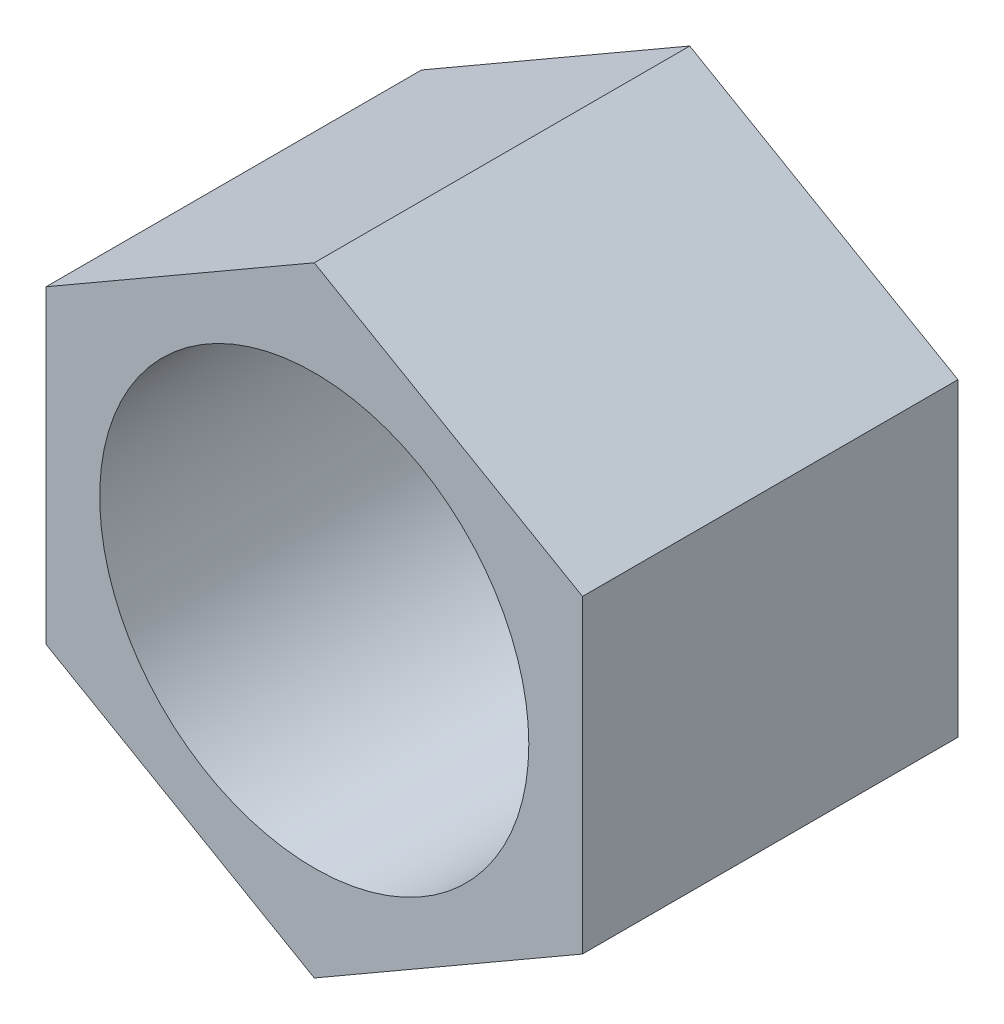
ISO-10303-21;
HEADER;
FILE_DESCRIPTION(('STEP AP214'),'2;1');
FILE_NAME('part.step','',(''),(''),'','','');
FILE_SCHEMA(('AUTOMOTIVE_DESIGN { 1 0 10303 214 1 1 1 1 }'));
ENDSEC;
DATA;
#1=APPLICATION_CONTEXT('core data for automotive mechanical design processes');
#2=APPLICATION_PROTOCOL_DEFINITION('international standard','automotive_design',2000,#1);
#3=PRODUCT_CONTEXT('',#1,'mechanical');
#4=PRODUCT('Part','Part','',(#3));
#5=PRODUCT_RELATED_PRODUCT_CATEGORY('part','',(#4));
#6=PRODUCT_DEFINITION_FORMATION('','',#4);
#7=PRODUCT_DEFINITION_CONTEXT('part definition',#1,'design');
#8=PRODUCT_DEFINITION('design','',#6,#7);
#9=PRODUCT_DEFINITION_SHAPE('','',#8);
#10=(LENGTH_UNIT() NAMED_UNIT(*) SI_UNIT(.MILLI.,.METRE.));
#11=(NAMED_UNIT(*) PLANE_ANGLE_UNIT() SI_UNIT($,.RADIAN.));
#12=(NAMED_UNIT(*) SI_UNIT($,.STERADIAN.) SOLID_ANGLE_UNIT());
#13=UNCERTAINTY_MEASURE_WITH_UNIT(LENGTH_MEASURE(1.E-05),#10,'distance_accuracy_value','');
#14=(GEOMETRIC_REPRESENTATION_CONTEXT(3) GLOBAL_UNCERTAINTY_ASSIGNED_CONTEXT((#13)) GLOBAL_UNIT_ASSIGNED_CONTEXT((#10,
#11,#12)) REPRESENTATION_CONTEXT('',''));
#15=CARTESIAN_POINT('',(0.,0.,0.));
#16=DIRECTION('',(0.,0.,1.));
#17=DIRECTION('',(1.,0.,0.));
#18=AXIS2_PLACEMENT_3D('',#15,#16,#17);
#19=CARTESIAN_POINT('',(-22.5,21.443375672974,10.));
#20=DIRECTION('',(-1.,0.,0.));
#21=DIRECTION('',(0.,0.,1.));
#22=AXIS2_PLACEMENT_3D('',#19,#20,#21);
#23=PLANE('',#22);
#24=DIRECTION('',(0.,-1.,0.));
#25=VECTOR('',#24,1.);
#26=CARTESIAN_POINT('',(-22.5,21.443375672974,13.5));
#27=LINE('',#26,#25);
#28=CARTESIAN_POINT('',(-22.5,21.443375672974,13.5));
#29=VERTEX_POINT('',#28);
#30=CARTESIAN_POINT('',(-22.5,18.5566243270259,13.5));
#31=VERTEX_POINT('',#30);
#32=EDGE_CURVE('E124',#29,#31,#27,.T.);
#33=ORIENTED_EDGE('',*,*,#32,.F.);
#34=DIRECTION('',(0.,0.,1.));
#35=VECTOR('',#34,1.);
#36=CARTESIAN_POINT('',(-22.5,21.443375672974,10.));
#37=LINE('',#36,#35);
#38=CARTESIAN_POINT('',(-22.5,21.443375672974,10.));
#39=VERTEX_POINT('',#38);
#40=EDGE_CURVE('E11',#39,#29,#37,.T.);
#41=ORIENTED_EDGE('',*,*,#40,.F.);
#42=DIRECTION('',(0.,-1.,0.));
#43=VECTOR('',#42,1.);
#44=CARTESIAN_POINT('',(-22.5,21.443375672974,10.));
#45=LINE('',#44,#43);
#46=CARTESIAN_POINT('',(-22.5,18.5566243270259,10.));
#47=VERTEX_POINT('',#46);
#48=EDGE_CURVE('E139',#39,#47,#45,.T.);
#49=ORIENTED_EDGE('',*,*,#48,.T.);
#50=DIRECTION('',(0.,0.,1.));
#51=VECTOR('',#50,1.);
#52=CARTESIAN_POINT('',(-22.5,18.5566243270259,10.));
#53=LINE('',#52,#51);
#54=EDGE_CURVE('E42',#47,#31,#53,.T.);
#55=ORIENTED_EDGE('',*,*,#54,.T.);
#56=EDGE_LOOP('',(#33,#41,#49,#55));
#57=FACE_BOUND('',#56,.T.);
#58=ADVANCED_FACE('F39',(#57),#23,.T.);
#59=CARTESIAN_POINT('',(-20.,22.8867513459481,10.));
#60=DIRECTION('',(-0.499999999999997,0.86602540378444,0.));
#61=DIRECTION('',(-0.866025403784441,-0.499999999999997,0.));
#62=AXIS2_PLACEMENT_3D('',#59,#60,#61);
#63=PLANE('',#62);
#64=DIRECTION('',(-0.86602540378444,-0.499999999999997,0.));
#65=VECTOR('',#64,1.);
#66=CARTESIAN_POINT('',(-20.,22.8867513459481,13.5));
#67=LINE('',#66,#65);
#68=CARTESIAN_POINT('',(-20.,22.8867513459481,13.5));
#69=VERTEX_POINT('',#68);
#70=EDGE_CURVE('E137',#69,#29,#67,.T.);
#71=ORIENTED_EDGE('',*,*,#70,.F.);
#72=DIRECTION('',(0.,0.,1.));
#73=VECTOR('',#72,1.);
#74=CARTESIAN_POINT('',(-20.,22.8867513459481,10.));
#75=LINE('',#74,#73);
#76=CARTESIAN_POINT('',(-20.,22.8867513459481,10.));
#77=VERTEX_POINT('',#76);
#78=EDGE_CURVE('E48',#77,#69,#75,.T.);
#79=ORIENTED_EDGE('',*,*,#78,.F.);
#80=DIRECTION('',(-0.86602540378444,-0.499999999999997,0.));
#81=VECTOR('',#80,1.);
#82=CARTESIAN_POINT('',(-20.,22.8867513459481,10.));
#83=LINE('',#82,#81);
#84=EDGE_CURVE('E114',#77,#39,#83,.T.);
#85=ORIENTED_EDGE('',*,*,#84,.T.);
#86=ORIENTED_EDGE('',*,*,#40,.T.);
#87=EDGE_LOOP('',(#71,#79,#85,#86));
#88=FACE_BOUND('',#87,.T.);
#89=ADVANCED_FACE('F147',(#88),#63,.T.);
#90=CARTESIAN_POINT('',(-17.5,21.443375672974,10.));
#91=DIRECTION('',(0.499999999999997,0.86602540378444,0.));
#92=DIRECTION('',(-0.866025403784441,0.499999999999997,0.));
#93=AXIS2_PLACEMENT_3D('',#90,#91,#92);
#94=PLANE('',#93);
#95=DIRECTION('',(-0.86602540378444,0.499999999999997,0.));
#96=VECTOR('',#95,1.);
#97=CARTESIAN_POINT('',(-17.5,21.443375672974,13.5));
#98=LINE('',#97,#96);
#99=CARTESIAN_POINT('',(-17.5,21.443375672974,13.5));
#100=VERTEX_POINT('',#99);
#101=EDGE_CURVE('E101',#100,#69,#98,.T.);
#102=ORIENTED_EDGE('',*,*,#101,.F.);
#103=DIRECTION('',(0.,0.,1.));
#104=VECTOR('',#103,1.);
#105=CARTESIAN_POINT('',(-17.5,21.443375672974,10.));
#106=LINE('',#105,#104);
#107=CARTESIAN_POINT('',(-17.5,21.443375672974,10.));
#108=VERTEX_POINT('',#107);
#109=EDGE_CURVE('E96',#108,#100,#106,.T.);
#110=ORIENTED_EDGE('',*,*,#109,.F.);
#111=DIRECTION('',(-0.86602540378444,0.499999999999997,0.));
#112=VECTOR('',#111,1.);
#113=CARTESIAN_POINT('',(-17.5,21.443375672974,10.));
#114=LINE('',#113,#112);
#115=EDGE_CURVE('E99',#108,#77,#114,.T.);
#116=ORIENTED_EDGE('',*,*,#115,.T.);
#117=ORIENTED_EDGE('',*,*,#78,.T.);
#118=EDGE_LOOP('',(#102,#110,#116,#117));
#119=FACE_BOUND('',#118,.T.);
#120=ADVANCED_FACE('F98',(#119),#94,.T.);
#121=CARTESIAN_POINT('',(-17.5,18.5566243270259,10.));
#122=DIRECTION('',(1.,0.,0.));
#123=DIRECTION('',(0.,0.,-1.));
#124=AXIS2_PLACEMENT_3D('',#121,#122,#123);
#125=PLANE('',#124);
#126=DIRECTION('',(0.,1.,0.));
#127=VECTOR('',#126,1.);
#128=CARTESIAN_POINT('',(-17.5,18.5566243270259,13.5));
#129=LINE('',#128,#127);
#130=CARTESIAN_POINT('',(-17.5,18.5566243270259,13.5));
#131=VERTEX_POINT('',#130);
#132=EDGE_CURVE('E134',#131,#100,#129,.T.);
#133=ORIENTED_EDGE('',*,*,#132,.F.);
#134=DIRECTION('',(0.,0.,1.));
#135=VECTOR('',#134,1.);
#136=CARTESIAN_POINT('',(-17.5,18.5566243270259,10.));
#137=LINE('',#136,#135);
#138=CARTESIAN_POINT('',(-17.5,18.5566243270259,10.));
#139=VERTEX_POINT('',#138);
#140=EDGE_CURVE('E106',#139,#131,#137,.T.);
#141=ORIENTED_EDGE('',*,*,#140,.F.);
#142=DIRECTION('',(0.,1.,0.));
#143=VECTOR('',#142,1.);
#144=CARTESIAN_POINT('',(-17.5,18.5566243270259,10.));
#145=LINE('',#144,#143);
#146=EDGE_CURVE('E112',#139,#108,#145,.T.);
#147=ORIENTED_EDGE('',*,*,#146,.T.);
#148=ORIENTED_EDGE('',*,*,#109,.T.);
#149=EDGE_LOOP('',(#133,#141,#147,#148));
#150=FACE_BOUND('',#149,.T.);
#151=ADVANCED_FACE('F116',(#150),#125,.T.);
#152=CARTESIAN_POINT('',(-20.,17.1132486540518,10.));
#153=DIRECTION('',(0.499999999999997,-0.86602540378444,0.));
#154=DIRECTION('',(0.866025403784441,0.499999999999997,0.));
#155=AXIS2_PLACEMENT_3D('',#152,#153,#154);
#156=PLANE('',#155);
#157=DIRECTION('',(0.86602540378444,0.499999999999997,0.));
#158=VECTOR('',#157,1.);
#159=CARTESIAN_POINT('',(-20.,17.1132486540518,13.5));
#160=LINE('',#159,#158);
#161=CARTESIAN_POINT('',(-20.,17.1132486540518,13.5));
#162=VERTEX_POINT('',#161);
#163=EDGE_CURVE('E131',#162,#131,#160,.T.);
#164=ORIENTED_EDGE('',*,*,#163,.F.);
#165=DIRECTION('',(0.,0.,1.));
#166=VECTOR('',#165,1.);
#167=CARTESIAN_POINT('',(-20.,17.1132486540518,10.));
#168=LINE('',#167,#166);
#169=CARTESIAN_POINT('',(-20.,17.1132486540518,10.));
#170=VERTEX_POINT('',#169);
#171=EDGE_CURVE('E142',#170,#162,#168,.T.);
#172=ORIENTED_EDGE('',*,*,#171,.F.);
#173=DIRECTION('',(0.86602540378444,0.499999999999997,0.));
#174=VECTOR('',#173,1.);
#175=CARTESIAN_POINT('',(-20.,17.1132486540518,10.));
#176=LINE('',#175,#174);
#177=EDGE_CURVE('E117',#170,#139,#176,.T.);
#178=ORIENTED_EDGE('',*,*,#177,.T.);
#179=ORIENTED_EDGE('',*,*,#140,.T.);
#180=EDGE_LOOP('',(#164,#172,#178,#179));
#181=FACE_BOUND('',#180,.T.);
#182=ADVANCED_FACE('F160',(#181),#156,.T.);
#183=CARTESIAN_POINT('',(-22.5,18.5566243270259,10.));
#184=DIRECTION('',(-0.50000000000001,-0.866025403784433,0.));
#185=DIRECTION('',(0.866025403784433,-0.50000000000001,0.));
#186=AXIS2_PLACEMENT_3D('',#183,#184,#185);
#187=PLANE('',#186);
#188=DIRECTION('',(0.866025403784433,-0.50000000000001,0.));
#189=VECTOR('',#188,1.);
#190=CARTESIAN_POINT('',(-22.5,18.5566243270259,13.5));
#191=LINE('',#190,#189);
#192=EDGE_CURVE('E127',#31,#162,#191,.T.);
#193=ORIENTED_EDGE('',*,*,#192,.F.);
#194=ORIENTED_EDGE('',*,*,#54,.F.);
#195=DIRECTION('',(0.866025403784433,-0.50000000000001,0.));
#196=VECTOR('',#195,1.);
#197=CARTESIAN_POINT('',(-22.5,18.5566243270259,10.));
#198=LINE('',#197,#196);
#199=EDGE_CURVE('E119',#47,#170,#198,.T.);
#200=ORIENTED_EDGE('',*,*,#199,.T.);
#201=ORIENTED_EDGE('',*,*,#171,.T.);
#202=EDGE_LOOP('',(#193,#194,#200,#201));
#203=FACE_BOUND('',#202,.T.);
#204=ADVANCED_FACE('F144',(#203),#187,.T.);
#205=CARTESIAN_POINT('',(0.,0.,10.));
#206=DIRECTION('',(0.,0.,1.));
#207=DIRECTION('',(1.,0.,0.));
#208=AXIS2_PLACEMENT_3D('',#205,#206,#207);
#209=PLANE('',#208);
#210=CARTESIAN_POINT('',(-20.,20.,10.));
#211=DIRECTION('',(0.,0.,1.));
#212=DIRECTION('',(-1.,0.,0.));
#213=AXIS2_PLACEMENT_3D('',#210,#211,#212);
#214=CIRCLE('',#213,2.);
#215=CARTESIAN_POINT('',(-18.,20.,10.));
#216=VERTEX_POINT('',#215);
#217=EDGE_CURVE('E128',#216,#216,#214,.T.);
#218=ORIENTED_EDGE('',*,*,#217,.T.);
#219=EDGE_LOOP('',(#218));
#220=FACE_BOUND('',#219,.T.);
#221=ORIENTED_EDGE('',*,*,#48,.F.);
#222=ORIENTED_EDGE('',*,*,#84,.F.);
#223=ORIENTED_EDGE('',*,*,#115,.F.);
#224=ORIENTED_EDGE('',*,*,#146,.F.);
#225=ORIENTED_EDGE('',*,*,#177,.F.);
#226=ORIENTED_EDGE('',*,*,#199,.F.);
#227=EDGE_LOOP('',(#221,#222,#223,#224,#225,#226));
#228=FACE_BOUND('',#227,.T.);
#229=ADVANCED_FACE('F110',(#220,#228),#209,.F.);
#230=CARTESIAN_POINT('',(0.,0.,13.5));
#231=DIRECTION('',(0.,0.,1.));
#232=DIRECTION('',(1.,0.,0.));
#233=AXIS2_PLACEMENT_3D('',#230,#231,#232);
#234=PLANE('',#233);
#235=CARTESIAN_POINT('',(-20.,20.,13.5));
#236=DIRECTION('',(0.,0.,1.));
#237=DIRECTION('',(-1.,0.,0.));
#238=AXIS2_PLACEMENT_3D('',#235,#236,#237);
#239=CIRCLE('',#238,2.);
#240=CARTESIAN_POINT('',(-18.,20.,13.5));
#241=VERTEX_POINT('',#240);
#242=EDGE_CURVE('E183',#241,#241,#239,.T.);
#243=ORIENTED_EDGE('',*,*,#242,.F.);
#244=EDGE_LOOP('',(#243));
#245=FACE_BOUND('',#244,.T.);
#246=ORIENTED_EDGE('',*,*,#32,.T.);
#247=ORIENTED_EDGE('',*,*,#192,.T.);
#248=ORIENTED_EDGE('',*,*,#163,.T.);
#249=ORIENTED_EDGE('',*,*,#132,.T.);
#250=ORIENTED_EDGE('',*,*,#101,.T.);
#251=ORIENTED_EDGE('',*,*,#70,.T.);
#252=EDGE_LOOP('',(#246,#247,#248,#249,#250,#251));
#253=FACE_BOUND('',#252,.T.);
#254=ADVANCED_FACE('F146',(#245,#253),#234,.T.);
#255=CARTESIAN_POINT('',(-20.,20.,10.));
#256=DIRECTION('',(0.,0.,1.));
#257=DIRECTION('',(1.,0.,0.));
#258=AXIS2_PLACEMENT_3D('',#255,#256,#257);
#259=CYLINDRICAL_SURFACE('',#258,2.);
#260=CARTESIAN_POINT('',(-18.,20.,10.));
#261=CARTESIAN_POINT('',(-18.,20.,10.0364583333333));
#262=CARTESIAN_POINT('',(-18.,20.,10.0729166666667));
#263=CARTESIAN_POINT('',(-18.,20.,10.1458333333333));
#264=CARTESIAN_POINT('',(-18.,20.,10.1822916666667));
#265=CARTESIAN_POINT('',(-18.,20.,10.2552083333333));
#266=CARTESIAN_POINT('',(-18.,20.,10.2916666666667));
#267=CARTESIAN_POINT('',(-18.,20.,10.3645833333333));
#268=CARTESIAN_POINT('',(-18.,20.,10.4010416666667));
#269=CARTESIAN_POINT('',(-18.,20.,10.4739583333333));
#270=CARTESIAN_POINT('',(-18.,20.,10.5104166666667));
#271=CARTESIAN_POINT('',(-18.,20.,10.5833333333333));
#272=CARTESIAN_POINT('',(-18.,20.,10.6197916666667));
#273=CARTESIAN_POINT('',(-18.,20.,10.6927083333333));
#274=CARTESIAN_POINT('',(-18.,20.,10.7291666666667));
#275=CARTESIAN_POINT('',(-18.,20.,10.8020833333333));
#276=CARTESIAN_POINT('',(-18.,20.,10.8385416666667));
#277=CARTESIAN_POINT('',(-18.,20.,10.9114583333333));
#278=CARTESIAN_POINT('',(-18.,20.,10.9479166666667));
#279=CARTESIAN_POINT('',(-18.,20.,11.0208333333333));
#280=CARTESIAN_POINT('',(-18.,20.,11.0572916666667));
#281=CARTESIAN_POINT('',(-18.,20.,11.1302083333333));
#282=CARTESIAN_POINT('',(-18.,20.,11.1666666666667));
#283=CARTESIAN_POINT('',(-18.,20.,11.2395833333333));
#284=CARTESIAN_POINT('',(-18.,20.,11.2760416666667));
#285=CARTESIAN_POINT('',(-18.,20.,11.3489583333333));
#286=CARTESIAN_POINT('',(-18.,20.,11.3854166666667));
#287=CARTESIAN_POINT('',(-18.,20.,11.4583333333333));
#288=CARTESIAN_POINT('',(-18.,20.,11.4947916666667));
#289=CARTESIAN_POINT('',(-18.,20.,11.5677083333333));
#290=CARTESIAN_POINT('',(-18.,20.,11.6041666666667));
#291=CARTESIAN_POINT('',(-18.,20.,11.6770833333333));
#292=CARTESIAN_POINT('',(-18.,20.,11.7135416666667));
#293=CARTESIAN_POINT('',(-18.,20.,11.7864583333333));
#294=CARTESIAN_POINT('',(-18.,20.,11.8229166666667));
#295=CARTESIAN_POINT('',(-18.,20.,11.8958333333333));
#296=CARTESIAN_POINT('',(-18.,20.,11.9322916666667));
#297=CARTESIAN_POINT('',(-18.,20.,12.0052083333333));
#298=CARTESIAN_POINT('',(-18.,20.,12.0416666666667));
#299=CARTESIAN_POINT('',(-18.,20.,12.1145833333333));
#300=CARTESIAN_POINT('',(-18.,20.,12.1510416666667));
#301=CARTESIAN_POINT('',(-18.,20.,12.2239583333333));
#302=CARTESIAN_POINT('',(-18.,20.,12.2604166666667));
#303=CARTESIAN_POINT('',(-18.,20.,12.3333333333333));
#304=CARTESIAN_POINT('',(-18.,20.,12.3697916666667));
#305=CARTESIAN_POINT('',(-18.,20.,12.4427083333333));
#306=CARTESIAN_POINT('',(-18.,20.,12.4791666666667));
#307=CARTESIAN_POINT('',(-18.,20.,12.5520833333333));
#308=CARTESIAN_POINT('',(-18.,20.,12.5885416666667));
#309=CARTESIAN_POINT('',(-18.,20.,12.6614583333333));
#310=CARTESIAN_POINT('',(-18.,20.,12.6979166666667));
#311=CARTESIAN_POINT('',(-18.,20.,12.7708333333333));
#312=CARTESIAN_POINT('',(-18.,20.,12.8072916666667));
#313=CARTESIAN_POINT('',(-18.,20.,12.8802083333333));
#314=CARTESIAN_POINT('',(-18.,20.,12.9166666666667));
#315=CARTESIAN_POINT('',(-18.,20.,12.9895833333333));
#316=CARTESIAN_POINT('',(-18.,20.,13.0260416666667));
#317=CARTESIAN_POINT('',(-18.,20.,13.0989583333333));
#318=CARTESIAN_POINT('',(-18.,20.,13.1354166666667));
#319=CARTESIAN_POINT('',(-18.,20.,13.2083333333333));
#320=CARTESIAN_POINT('',(-18.,20.,13.2447916666667));
#321=CARTESIAN_POINT('',(-18.,20.,13.3177083333333));
#322=CARTESIAN_POINT('',(-18.,20.,13.3541666666667));
#323=CARTESIAN_POINT('',(-18.,20.,13.4270833333333));
#324=CARTESIAN_POINT('',(-18.,20.,13.4635416666667));
#325=CARTESIAN_POINT('',(-18.,20.,13.5));
#326=B_SPLINE_CURVE_WITH_KNOTS('',3,(#260,#261,#262,#263,#264,#265,#266,#267,#268,#269,#270,
#271,#272,#273,#274,#275,#276,#277,#278,#279,#280,#281,#282,#283,#284,#285,#286,#287,#288,#289,
#290,#291,#292,#293,#294,#295,#296,#297,#298,#299,#300,#301,#302,#303,#304,#305,#306,#307,#308,
#309,#310,#311,#312,#313,#314,#315,#316,#317,#318,#319,#320,#321,#322,#323,#324,#325),
.UNSPECIFIED.,.F.,.F.,(4,2,2,2,2,2,2,2,2,2,2,2,2,2,2,2,2,2,2,2,2,2,2,2,2,2,2,2,2,2,2,2,4),(0.,
0.109374999999998,0.218749999999998,0.328124999999999,0.437499999999999,0.546874999999999,
0.656249999999999,0.765624999999999,0.874999999999999,0.984374999999999,1.09375,1.203125,1.3125,
1.421875,1.53125,1.640625,1.75,1.859375,1.96875,2.078125,2.1875,2.296875,2.40625,2.515625,2.625,
2.734375,2.84375,2.953125,3.0625,3.171875,3.28125,3.390625,3.5),.UNSPECIFIED.);
#327=EDGE_CURVE('BSEAM171',#216,#241,#326,.T.);
#328=ORIENTED_EDGE('',*,*,#217,.F.);
#329=ORIENTED_EDGE('',*,*,#242,.T.);
#330=ORIENTED_EDGE('',*,*,#327,.T.);
#331=ORIENTED_EDGE('',*,*,#327,.F.);
#332=EDGE_LOOP('',(#328,#330,#329,#331));
#333=FACE_BOUND('',#332,.T.);
#334=ADVANCED_FACE('F171',(#333),#259,.F.);
#335=CLOSED_SHELL('',(#58,#89,#120,#151,#182,#204,#229,#254,#334));
#336=MANIFOLD_SOLID_BREP('B2',#335);
#337=ADVANCED_BREP_SHAPE_REPRESENTATION('',(#18,#336),#14);
#338=SHAPE_DEFINITION_REPRESENTATION(#9,#337);
ENDSEC;
END-ISO-10303-21;
